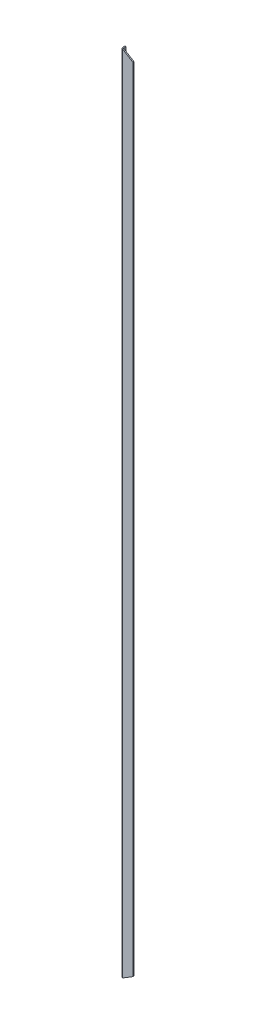
ISO-10303-21;
HEADER;
FILE_DESCRIPTION(('STEP AP214'),'2;1');
FILE_NAME('part.step','',(''),(''),'','','');
FILE_SCHEMA(('AUTOMOTIVE_DESIGN { 1 0 10303 214 1 1 1 1 }'));
ENDSEC;
DATA;
#1=APPLICATION_CONTEXT('core data for automotive mechanical design processes');
#2=APPLICATION_PROTOCOL_DEFINITION('international standard','automotive_design',2000,#1);
#3=PRODUCT_CONTEXT('',#1,'mechanical');
#4=PRODUCT('Part','Part','',(#3));
#5=PRODUCT_RELATED_PRODUCT_CATEGORY('part','',(#4));
#6=PRODUCT_DEFINITION_FORMATION('','',#4);
#7=PRODUCT_DEFINITION_CONTEXT('part definition',#1,'design');
#8=PRODUCT_DEFINITION('design','',#6,#7);
#9=PRODUCT_DEFINITION_SHAPE('','',#8);
#10=(LENGTH_UNIT() NAMED_UNIT(*) SI_UNIT(.MILLI.,.METRE.));
#11=(NAMED_UNIT(*) PLANE_ANGLE_UNIT() SI_UNIT($,.RADIAN.));
#12=(NAMED_UNIT(*) SI_UNIT($,.STERADIAN.) SOLID_ANGLE_UNIT());
#13=UNCERTAINTY_MEASURE_WITH_UNIT(LENGTH_MEASURE(1.E-05),#10,'distance_accuracy_value','');
#14=(GEOMETRIC_REPRESENTATION_CONTEXT(3) GLOBAL_UNCERTAINTY_ASSIGNED_CONTEXT((#13)) GLOBAL_UNIT_ASSIGNED_CONTEXT((#10,
#11,#12)) REPRESENTATION_CONTEXT('',''));
#15=CARTESIAN_POINT('',(0.,0.,0.));
#16=DIRECTION('',(0.,0.,1.));
#17=DIRECTION('',(1.,0.,0.));
#18=AXIS2_PLACEMENT_3D('',#15,#16,#17);
#19=CARTESIAN_POINT('',(3791.85552570873,-1200.,859.999999999999));
#20=DIRECTION('',(0.,0.,-1.));
#21=DIRECTION('',(0.,-1.,0.));
#22=AXIS2_PLACEMENT_3D('',#19,#20,#21);
#23=PLANE('',#22);
#24=DIRECTION('',(0.,1.,0.));
#25=VECTOR('',#24,1.);
#26=CARTESIAN_POINT('',(-373.333333333333,-155.,859.999999999999));
#27=LINE('',#26,#25);
#28=CARTESIAN_POINT('',(-373.333333333333,-1196.29289321881,860.));
#29=VERTEX_POINT('',#28);
#30=CARTESIAN_POINT('',(-373.333333333333,886.292893218813,860.));
#31=VERTEX_POINT('',#30);
#32=EDGE_CURVE('E134',#29,#31,#27,.T.);
#33=ORIENTED_EDGE('',*,*,#32,.T.);
#34=DIRECTION('',(-1.,0.,0.));
#35=VECTOR('',#34,1.);
#36=CARTESIAN_POINT('',(3791.85552570873,886.292893218813,860.));
#37=LINE('',#36,#35);
#38=CARTESIAN_POINT('',(-370.333333333333,886.292893218813,860.));
#39=VERTEX_POINT('',#38);
#40=EDGE_CURVE('E148',#39,#31,#37,.T.);
#41=ORIENTED_EDGE('',*,*,#40,.F.);
#42=DIRECTION('',(0.,1.,0.));
#43=VECTOR('',#42,1.);
#44=CARTESIAN_POINT('',(-370.333333333333,-1200.,859.999999999999));
#45=LINE('',#44,#43);
#46=CARTESIAN_POINT('',(-370.333333333333,-1196.29289321881,860.));
#47=VERTEX_POINT('',#46);
#48=EDGE_CURVE('E69',#39,#47,#45,.F.);
#49=ORIENTED_EDGE('',*,*,#48,.T.);
#50=DIRECTION('',(-1.,0.,0.));
#51=VECTOR('',#50,1.);
#52=CARTESIAN_POINT('',(3791.85552570873,-1196.29289321881,860.));
#53=LINE('',#52,#51);
#54=EDGE_CURVE('E138',#47,#29,#53,.T.);
#55=ORIENTED_EDGE('',*,*,#54,.T.);
#56=EDGE_LOOP('',(#33,#41,#49,#55));
#57=FACE_BOUND('',#56,.T.);
#58=ADVANCED_FACE('F48',(#57),#23,.T.);
#59=CARTESIAN_POINT('',(3791.85552570873,-1196.29289321881,866.999999999999));
#60=DIRECTION('',(0.,-1.,0.));
#61=DIRECTION('',(1.,0.,0.));
#62=AXIS2_PLACEMENT_3D('',#59,#60,#61);
#63=PLANE('',#62);
#64=DIRECTION('',(0.,0.,-1.));
#65=VECTOR('',#64,1.);
#66=CARTESIAN_POINT('',(-373.333333333333,-1196.29289321881,866.999999999999));
#67=LINE('',#66,#65);
#68=CARTESIAN_POINT('',(-373.333333333333,-1196.29289321881,866.));
#69=VERTEX_POINT('',#68);
#70=EDGE_CURVE('E127',#69,#29,#67,.T.);
#71=ORIENTED_EDGE('',*,*,#70,.T.);
#72=ORIENTED_EDGE('',*,*,#54,.F.);
#73=DIRECTION('',(0.,0.,-1.));
#74=VECTOR('',#73,1.);
#75=CARTESIAN_POINT('',(-370.333333333333,-1196.29289321881,866.999999999999));
#76=LINE('',#75,#74);
#77=CARTESIAN_POINT('',(-370.333333333333,-1196.29289321881,865.999999999999));
#78=VERTEX_POINT('',#77);
#79=EDGE_CURVE('E137',#47,#78,#76,.F.);
#80=ORIENTED_EDGE('',*,*,#79,.T.);
#81=CARTESIAN_POINT('',(-373.333333333333,-1196.29289321881,866.));
#82=CARTESIAN_POINT('',(-370.333333333333,-1196.29289321881,866.));
#83=B_SPLINE_CURVE_WITH_KNOTS('',1,(#81,#82),.UNSPECIFIED.,.F.,.F.,(2,2),(0.,1.),.UNSPECIFIED.);
#84=EDGE_CURVE('E141',#78,#69,#83,.F.);
#85=ORIENTED_EDGE('',*,*,#84,.T.);
#86=EDGE_LOOP('',(#71,#72,#80,#85));
#87=FACE_BOUND('',#86,.T.);
#88=ADVANCED_FACE('F143',(#87),#63,.T.);
#89=CARTESIAN_POINT('',(-373.333333333333,-155.,866.999999999999));
#90=DIRECTION('',(1.,0.,0.));
#91=DIRECTION('',(0.,0.,-1.));
#92=AXIS2_PLACEMENT_3D('',#89,#90,#91);
#93=PLANE('',#92);
#94=ORIENTED_EDGE('',*,*,#32,.F.);
#95=ORIENTED_EDGE('',*,*,#70,.F.);
#96=DIRECTION('',(0.,1.,0.));
#97=VECTOR('',#96,1.);
#98=CARTESIAN_POINT('',(-373.333333333333,886.292893218813,865.999999999999));
#99=LINE('',#98,#97);
#100=CARTESIAN_POINT('',(-373.333333333333,886.292893218813,866.));
#101=VERTEX_POINT('',#100);
#102=EDGE_CURVE('E132',#101,#69,#99,.F.);
#103=ORIENTED_EDGE('',*,*,#102,.F.);
#104=DIRECTION('',(0.,0.,-1.));
#105=VECTOR('',#104,1.);
#106=CARTESIAN_POINT('',(-373.333333333333,886.292893218813,866.999999999999));
#107=LINE('',#106,#105);
#108=EDGE_CURVE('E176',#31,#101,#107,.F.);
#109=ORIENTED_EDGE('',*,*,#108,.F.);
#110=EDGE_LOOP('',(#94,#95,#103,#109));
#111=FACE_BOUND('',#110,.T.);
#112=ADVANCED_FACE('F129',(#111),#93,.F.);
#113=CARTESIAN_POINT('',(3791.85552570873,886.292893218813,866.999999999999));
#114=DIRECTION('',(0.,-1.,0.));
#115=DIRECTION('',(1.,0.,0.));
#116=AXIS2_PLACEMENT_3D('',#113,#114,#115);
#117=PLANE('',#116);
#118=ORIENTED_EDGE('',*,*,#40,.T.);
#119=ORIENTED_EDGE('',*,*,#108,.T.);
#120=CARTESIAN_POINT('',(-370.333333333333,886.292893218811,866.));
#121=CARTESIAN_POINT('',(-373.333333333333,886.292893218811,866.));
#122=B_SPLINE_CURVE_WITH_KNOTS('',1,(#120,#121),.UNSPECIFIED.,.F.,.F.,(2,2),(0.,1.),.UNSPECIFIED.);
#123=CARTESIAN_POINT('',(-370.333333333333,886.292893218813,866.));
#124=VERTEX_POINT('',#123);
#125=EDGE_CURVE('E167',#124,#101,#122,.T.);
#126=ORIENTED_EDGE('',*,*,#125,.F.);
#127=DIRECTION('',(0.,0.,-1.));
#128=VECTOR('',#127,1.);
#129=CARTESIAN_POINT('',(-370.333333333333,886.292893218813,866.999999999999));
#130=LINE('',#129,#128);
#131=EDGE_CURVE('E60',#39,#124,#130,.F.);
#132=ORIENTED_EDGE('',*,*,#131,.F.);
#133=EDGE_LOOP('',(#118,#119,#126,#132));
#134=FACE_BOUND('',#133,.T.);
#135=ADVANCED_FACE('F186',(#134),#117,.F.);
#136=CARTESIAN_POINT('',(-370.333333333333,-155.,866.999999999999));
#137=DIRECTION('',(1.,0.,0.));
#138=DIRECTION('',(0.,0.,-1.));
#139=AXIS2_PLACEMENT_3D('',#136,#137,#138);
#140=PLANE('',#139);
#141=ORIENTED_EDGE('',*,*,#131,.T.);
#142=DIRECTION('',(0.,1.,0.));
#143=VECTOR('',#142,1.);
#144=CARTESIAN_POINT('',(-370.333333333333,886.292893218813,865.999999999999));
#145=LINE('',#144,#143);
#146=EDGE_CURVE('E13',#124,#78,#145,.F.);
#147=ORIENTED_EDGE('',*,*,#146,.T.);
#148=ORIENTED_EDGE('',*,*,#79,.F.);
#149=ORIENTED_EDGE('',*,*,#48,.F.);
#150=EDGE_LOOP('',(#141,#147,#148,#149));
#151=FACE_BOUND('',#150,.T.);
#152=ADVANCED_FACE('F50',(#151),#140,.T.);
#153=CARTESIAN_POINT('',(-343.333333333333,-1180.,-3294.32467514242));
#154=DIRECTION('',(-1.,0.,0.));
#155=DIRECTION('',(0.,0.,1.));
#156=AXIS2_PLACEMENT_3D('',#153,#154,#155);
#157=PLANE('',#156);
#158=DIRECTION('',(0.,1.,0.));
#159=VECTOR('',#158,1.);
#160=CARTESIAN_POINT('',(-343.333333333333,-155.,869.999999999999));
#161=LINE('',#160,#159);
#162=CARTESIAN_POINT('',(-343.333333333333,-1180.,869.999999999999));
#163=VERTEX_POINT('',#162);
#164=CARTESIAN_POINT('',(-343.333333333333,870.,869.999999999999));
#165=VERTEX_POINT('',#164);
#166=EDGE_CURVE('E94',#163,#165,#161,.T.);
#167=ORIENTED_EDGE('',*,*,#166,.F.);
#168=DIRECTION('',(0.,0.,1.));
#169=VECTOR('',#168,1.);
#170=CARTESIAN_POINT('',(-343.333333333333,-1180.,-3294.32467514242));
#171=LINE('',#170,#169);
#172=CARTESIAN_POINT('',(-343.333333333333,-1180.,867.));
#173=VERTEX_POINT('',#172);
#174=EDGE_CURVE('E170',#173,#163,#171,.T.);
#175=ORIENTED_EDGE('',*,*,#174,.F.);
#176=DIRECTION('',(0.,1.,0.));
#177=VECTOR('',#176,1.);
#178=CARTESIAN_POINT('',(-343.333333333333,-1180.,867.));
#179=LINE('',#178,#177);
#180=CARTESIAN_POINT('',(-343.333333333333,870.,867.));
#181=VERTEX_POINT('',#180);
#182=EDGE_CURVE('E242',#181,#173,#179,.F.);
#183=ORIENTED_EDGE('',*,*,#182,.F.);
#184=DIRECTION('',(0.,0.,1.));
#185=VECTOR('',#184,1.);
#186=CARTESIAN_POINT('',(-343.333333333333,870.,-3294.32467514242));
#187=LINE('',#186,#185);
#188=EDGE_CURVE('E265',#181,#165,#187,.T.);
#189=ORIENTED_EDGE('',*,*,#188,.T.);
#190=EDGE_LOOP('',(#167,#175,#183,#189));
#191=FACE_BOUND('',#190,.T.);
#192=ADVANCED_FACE('F202',(#191),#157,.F.);
#193=CARTESIAN_POINT('',(363.205786838341,-745.20669527897,-3294.32467514242));
#194=DIRECTION('',(-0.524097425664335,0.851658316704544,0.));
#195=DIRECTION('',(-0.851658316704544,-0.524097425664335,0.));
#196=AXIS2_PLACEMENT_3D('',#193,#194,#195);
#197=PLANE('',#196);
#198=DIRECTION('',(-0.851658316704544,-0.524097425664335,0.));
#199=VECTOR('',#198,1.);
#200=CARTESIAN_POINT('',(363.205786838341,-745.20669527897,869.999999999999));
#201=LINE('',#200,#199);
#202=CARTESIAN_POINT('',(-369.333333333333,-1196.,869.999999999999));
#203=VERTEX_POINT('',#202);
#204=EDGE_CURVE('E101',#163,#203,#201,.T.);
#205=ORIENTED_EDGE('',*,*,#204,.T.);
#206=CARTESIAN_POINT('',(-369.333333333333,-1196.,867.));
#207=CARTESIAN_POINT('',(-369.333333333333,-1196.,869.999999999999));
#208=B_SPLINE_CURVE_WITH_KNOTS('',1,(#206,#207),.UNSPECIFIED.,.F.,.F.,(2,2),(0.,1.),.UNSPECIFIED.);
#209=CARTESIAN_POINT('',(-369.333333333333,-1196.,867.));
#210=VERTEX_POINT('',#209);
#211=EDGE_CURVE('E155',#210,#203,#208,.T.);
#212=ORIENTED_EDGE('',*,*,#211,.F.);
#213=DIRECTION('',(-0.851658316704544,-0.524097425664335,0.));
#214=VECTOR('',#213,1.);
#215=CARTESIAN_POINT('',(363.205786838341,-745.20669527897,867.));
#216=LINE('',#215,#214);
#217=EDGE_CURVE('E269',#173,#210,#216,.T.);
#218=ORIENTED_EDGE('',*,*,#217,.F.);
#219=ORIENTED_EDGE('',*,*,#174,.T.);
#220=EDGE_LOOP('',(#205,#212,#218,#219));
#221=FACE_BOUND('',#220,.T.);
#222=ADVANCED_FACE('F205',(#221),#197,.F.);
#223=CARTESIAN_POINT('',(363.205786838342,435.206695278963,-3294.32467514242));
#224=DIRECTION('',(-0.52409742566434,-0.851658316704541,0.));
#225=DIRECTION('',(0.851658316704541,-0.52409742566434,0.));
#226=AXIS2_PLACEMENT_3D('',#223,#224,#225);
#227=PLANE('',#226);
#228=DIRECTION('',(0.851658316704541,-0.52409742566434,0.));
#229=VECTOR('',#228,1.);
#230=CARTESIAN_POINT('',(363.205786838342,435.206695278963,869.999999999999));
#231=LINE('',#230,#229);
#232=CARTESIAN_POINT('',(-369.333333333333,886.,870.));
#233=VERTEX_POINT('',#232);
#234=EDGE_CURVE('E243',#233,#165,#231,.T.);
#235=ORIENTED_EDGE('',*,*,#234,.T.);
#236=ORIENTED_EDGE('',*,*,#188,.F.);
#237=DIRECTION('',(0.851658316704541,-0.52409742566434,0.));
#238=VECTOR('',#237,1.);
#239=CARTESIAN_POINT('',(363.205786838342,435.206695278963,867.));
#240=LINE('',#239,#238);
#241=CARTESIAN_POINT('',(-369.333333333333,886.,866.999999999999));
#242=VERTEX_POINT('',#241);
#243=EDGE_CURVE('E263',#242,#181,#240,.T.);
#244=ORIENTED_EDGE('',*,*,#243,.F.);
#245=CARTESIAN_POINT('',(-369.333333333333,885.999999999998,869.999999999999));
#246=CARTESIAN_POINT('',(-369.333333333333,885.999999999998,867.));
#247=B_SPLINE_CURVE_WITH_KNOTS('',1,(#245,#246),.UNSPECIFIED.,.F.,.F.,(2,2),(0.,1.),.UNSPECIFIED.);
#248=EDGE_CURVE('E259',#242,#233,#247,.F.);
#249=ORIENTED_EDGE('',*,*,#248,.T.);
#250=EDGE_LOOP('',(#235,#236,#244,#249));
#251=FACE_BOUND('',#250,.T.);
#252=ADVANCED_FACE('F209',(#251),#227,.F.);
#253=CARTESIAN_POINT('',(0.00166666666712167,-155.,867.));
#254=DIRECTION('',(0.,0.,1.));
#255=DIRECTION('',(1.,0.,0.));
#256=AXIS2_PLACEMENT_3D('',#253,#254,#255);
#257=PLANE('',#256);
#258=ORIENTED_EDGE('',*,*,#182,.T.);
#259=ORIENTED_EDGE('',*,*,#217,.T.);
#260=DIRECTION('',(0.,1.,0.));
#261=VECTOR('',#260,1.);
#262=CARTESIAN_POINT('',(-369.333333333333,-155.,867.));
#263=LINE('',#262,#261);
#264=EDGE_CURVE('E266',#242,#210,#263,.F.);
#265=ORIENTED_EDGE('',*,*,#264,.F.);
#266=ORIENTED_EDGE('',*,*,#243,.T.);
#267=EDGE_LOOP('',(#258,#259,#265,#266));
#268=FACE_BOUND('',#267,.T.);
#269=ADVANCED_FACE('F420',(#268),#257,.F.);
#270=CARTESIAN_POINT('',(0.00166666666712167,-155.,869.999999999999));
#271=DIRECTION('',(0.,0.,1.));
#272=DIRECTION('',(1.,0.,0.));
#273=AXIS2_PLACEMENT_3D('',#270,#271,#272);
#274=PLANE('',#273);
#275=ORIENTED_EDGE('',*,*,#204,.F.);
#276=ORIENTED_EDGE('',*,*,#166,.T.);
#277=ORIENTED_EDGE('',*,*,#234,.F.);
#278=DIRECTION('',(0.,1.,0.));
#279=VECTOR('',#278,1.);
#280=CARTESIAN_POINT('',(-369.333333333333,-155.,869.999999999999));
#281=LINE('',#280,#279);
#282=EDGE_CURVE('E240',#233,#203,#281,.F.);
#283=ORIENTED_EDGE('',*,*,#282,.T.);
#284=EDGE_LOOP('',(#275,#276,#277,#283));
#285=FACE_BOUND('',#284,.T.);
#286=ADVANCED_FACE('F415',(#285),#274,.T.);
#287=CARTESIAN_POINT('',(-373.333333333333,-1196.29289321881,866.));
#288=CARTESIAN_POINT('',(-373.333333333333,-1196.26848105947,866.523692974338));
#289=CARTESIAN_POINT('',(-373.229224040006,-1196.24407768235,867.046991537437));
#290=CARTESIAN_POINT('',(-372.82847888675,-1196.19526214588,868.014475921483));
#291=CARTESIAN_POINT('',(-372.532000702925,-1196.17085437764,868.458186879899));
#292=CARTESIAN_POINT('',(-371.791520213232,-1196.12203884117,869.198667369592));
#293=CARTESIAN_POINT('',(-371.347809254816,-1196.09763107294,869.495145553417));
#294=CARTESIAN_POINT('',(-370.38032487077,-1196.04881553647,869.895890706673));
#295=CARTESIAN_POINT('',(-369.857026307671,-1196.02441215935,869.999999999999));
#296=CARTESIAN_POINT('',(-369.333333333333,-1196.,869.999999999999));
#297=CARTESIAN_POINT('',(-370.333333333333,-1196.29289321881,866.));
#298=CARTESIAN_POINT('',(-370.333333333333,-1196.26848119779,866.130922501774));
#299=CARTESIAN_POINT('',(-370.307306010001,-1196.24407768235,866.261747884359));
#300=CARTESIAN_POINT('',(-370.207119721687,-1196.19526214588,866.503618980371));
#301=CARTESIAN_POINT('',(-370.133000175731,-1196.17085437764,866.614546719975));
#302=CARTESIAN_POINT('',(-369.947880053308,-1196.12203884117,866.799666842398));
#303=CARTESIAN_POINT('',(-369.836952313704,-1196.09763107294,866.873786388354));
#304=CARTESIAN_POINT('',(-369.595081217692,-1196.04881553647,866.973972676668));
#305=CARTESIAN_POINT('',(-369.464255835108,-1196.02441202103,867.));
#306=CARTESIAN_POINT('',(-369.333333333333,-1196.,867.));
#307=B_SPLINE_SURFACE_WITH_KNOTS('',1,3,((#287,#288,#289,#290,#291,#292,#293,#294,#295,#296),
(#297,#298,#299,#300,#301,#302,#303,#304,#305,#306)),.UNSPECIFIED.,.F.,.F.,.F.,(2,2),(4,2,2,2,
4),(0.,1.),(0.,0.25,0.5,0.75,1.),.UNSPECIFIED.);
#308=CARTESIAN_POINT('',(-370.333333333333,-1196.29289321881,866.));
#309=CARTESIAN_POINT('',(-370.333333333333,-1196.26848119779,866.130922501774));
#310=CARTESIAN_POINT('',(-370.307306010001,-1196.24407768235,866.261747884359));
#311=CARTESIAN_POINT('',(-370.207119721687,-1196.19526214588,866.503618980371));
#312=CARTESIAN_POINT('',(-370.133000175731,-1196.17085437764,866.614546719975));
#313=CARTESIAN_POINT('',(-369.947880053308,-1196.12203884117,866.799666842398));
#314=CARTESIAN_POINT('',(-369.836952313704,-1196.09763107294,866.873786388354));
#315=CARTESIAN_POINT('',(-369.595081217692,-1196.04881553647,866.973972676668));
#316=CARTESIAN_POINT('',(-369.464255835108,-1196.02441202103,867.));
#317=CARTESIAN_POINT('',(-369.333333333333,-1196.,867.));
#318=B_SPLINE_CURVE_WITH_KNOTS('',3,(#308,#309,#310,#311,#312,#313,#314,#315,#316,#317),
.UNSPECIFIED.,.F.,.F.,(4,2,2,2,4),(0.,0.25,0.5,0.75,1.),.UNSPECIFIED.);
#319=EDGE_CURVE('E354',#78,#210,#318,.T.);
#320=CARTESIAN_POINT('',(-369.333333333333,-1196.,869.999999999999));
#321=CARTESIAN_POINT('',(-369.857026307671,-1196.02441215935,869.999999999999));
#322=CARTESIAN_POINT('',(-370.38032487077,-1196.04881553647,869.895890706673));
#323=CARTESIAN_POINT('',(-371.347809254816,-1196.09763107294,869.495145553417));
#324=CARTESIAN_POINT('',(-371.791520213232,-1196.12203884117,869.198667369592));
#325=CARTESIAN_POINT('',(-372.532000702925,-1196.17085437764,868.458186879899));
#326=CARTESIAN_POINT('',(-372.82847888675,-1196.19526214588,868.014475921483));
#327=CARTESIAN_POINT('',(-373.229224040006,-1196.24407768235,867.046991537437));
#328=CARTESIAN_POINT('',(-373.333333333333,-1196.26848105947,866.523692974338));
#329=CARTESIAN_POINT('',(-373.333333333333,-1196.29289321881,866.));
#330=B_SPLINE_CURVE_WITH_KNOTS('',3,(#320,#321,#322,#323,#324,#325,#326,#327,#328,#329),
.UNSPECIFIED.,.F.,.F.,(4,2,2,2,4),(0.,0.25,0.5,0.75,1.),.UNSPECIFIED.);
#331=EDGE_CURVE('E152',#69,#203,#330,.F.);
#332=ORIENTED_EDGE('',*,*,#84,.F.);
#333=ORIENTED_EDGE('',*,*,#319,.T.);
#334=ORIENTED_EDGE('',*,*,#211,.T.);
#335=ORIENTED_EDGE('',*,*,#331,.F.);
#336=EDGE_LOOP('',(#332,#333,#334,#335));
#337=FACE_BOUND('',#336,.T.);
#338=ADVANCED_FACE('F154',(#337),#307,.T.);
#339=CARTESIAN_POINT('',(-369.333333333333,885.999999999998,869.999999999999));
#340=CARTESIAN_POINT('',(-369.857026307672,886.024412159345,869.999999999999));
#341=CARTESIAN_POINT('',(-370.38032487077,886.048815536467,869.895890706673));
#342=CARTESIAN_POINT('',(-371.347809254816,886.097631072936,869.495145553417));
#343=CARTESIAN_POINT('',(-371.791520213232,886.12203884117,869.198667369592));
#344=CARTESIAN_POINT('',(-372.532000702925,886.170854377639,868.458186879899));
#345=CARTESIAN_POINT('',(-372.82847888675,886.195262145874,868.014475921483));
#346=CARTESIAN_POINT('',(-373.229224040006,886.244077682343,867.046991537437));
#347=CARTESIAN_POINT('',(-373.333333333333,886.268481059465,866.523692974338));
#348=CARTESIAN_POINT('',(-373.333333333333,886.292893218811,866.));
#349=CARTESIAN_POINT('',(-369.333333333333,885.999999999998,867.));
#350=CARTESIAN_POINT('',(-369.464255835108,886.024412021026,867.));
#351=CARTESIAN_POINT('',(-369.595081217692,886.048815536467,866.973972676668));
#352=CARTESIAN_POINT('',(-369.836952313704,886.097631072936,866.873786388354));
#353=CARTESIAN_POINT('',(-369.947880053308,886.12203884117,866.799666842398));
#354=CARTESIAN_POINT('',(-370.133000175731,886.170854377639,866.614546719975));
#355=CARTESIAN_POINT('',(-370.207119721687,886.195262145874,866.50361898037));
#356=CARTESIAN_POINT('',(-370.307306010001,886.244077682343,866.261747884359));
#357=CARTESIAN_POINT('',(-370.333333333333,886.268481197784,866.130922501776));
#358=CARTESIAN_POINT('',(-370.333333333333,886.292893218811,866.));
#359=B_SPLINE_SURFACE_WITH_KNOTS('',1,3,((#339,#340,#341,#342,#343,#344,#345,#346,#347,#348),
(#349,#350,#351,#352,#353,#354,#355,#356,#357,#358)),.UNSPECIFIED.,.F.,.F.,.F.,(2,2),(4,2,2,2,
4),(0.,1.),(0.,0.25,0.5,0.75,1.),.UNSPECIFIED.);
#360=CARTESIAN_POINT('',(-369.333333333333,885.999999999998,867.));
#361=CARTESIAN_POINT('',(-369.464255835108,886.024412021026,867.));
#362=CARTESIAN_POINT('',(-369.595081217692,886.048815536467,866.973972676668));
#363=CARTESIAN_POINT('',(-369.836952313704,886.097631072936,866.873786388354));
#364=CARTESIAN_POINT('',(-369.947880053308,886.12203884117,866.799666842398));
#365=CARTESIAN_POINT('',(-370.133000175731,886.170854377639,866.614546719975));
#366=CARTESIAN_POINT('',(-370.207119721687,886.195262145874,866.50361898037));
#367=CARTESIAN_POINT('',(-370.307306010001,886.244077682343,866.261747884359));
#368=CARTESIAN_POINT('',(-370.333333333333,886.268481197784,866.130922501776));
#369=CARTESIAN_POINT('',(-370.333333333333,886.292893218811,866.));
#370=B_SPLINE_CURVE_WITH_KNOTS('',3,(#360,#361,#362,#363,#364,#365,#366,#367,#368,#369),
.UNSPECIFIED.,.F.,.F.,(4,2,2,2,4),(0.,0.25,0.5,0.75,1.),.UNSPECIFIED.);
#371=EDGE_CURVE('E364',#242,#124,#370,.T.);
#372=CARTESIAN_POINT('',(-373.333333333333,886.292893218811,866.));
#373=CARTESIAN_POINT('',(-373.333333333333,886.268481059465,866.523692974338));
#374=CARTESIAN_POINT('',(-373.229224040006,886.244077682343,867.046991537437));
#375=CARTESIAN_POINT('',(-372.82847888675,886.195262145874,868.014475921483));
#376=CARTESIAN_POINT('',(-372.532000702925,886.170854377639,868.458186879899));
#377=CARTESIAN_POINT('',(-371.791520213232,886.12203884117,869.198667369592));
#378=CARTESIAN_POINT('',(-371.347809254816,886.097631072936,869.495145553417));
#379=CARTESIAN_POINT('',(-370.38032487077,886.048815536467,869.895890706673));
#380=CARTESIAN_POINT('',(-369.857026307672,886.024412159345,869.999999999999));
#381=CARTESIAN_POINT('',(-369.333333333333,885.999999999998,869.999999999999));
#382=B_SPLINE_CURVE_WITH_KNOTS('',3,(#372,#373,#374,#375,#376,#377,#378,#379,#380,#381),
.UNSPECIFIED.,.F.,.F.,(4,2,2,2,4),(0.,0.25,0.5,0.75,1.),.UNSPECIFIED.);
#383=EDGE_CURVE('E160',#233,#101,#382,.F.);
#384=ORIENTED_EDGE('',*,*,#248,.F.);
#385=ORIENTED_EDGE('',*,*,#371,.T.);
#386=ORIENTED_EDGE('',*,*,#125,.T.);
#387=ORIENTED_EDGE('',*,*,#383,.F.);
#388=EDGE_LOOP('',(#384,#385,#386,#387));
#389=FACE_BOUND('',#388,.T.);
#390=ADVANCED_FACE('F283',(#389),#359,.T.);
#391=CARTESIAN_POINT('',(-369.333333333333,-3279.0284782838,866.));
#392=DIRECTION('',(0.,1.,0.));
#393=DIRECTION('',(0.,0.,1.));
#394=AXIS2_PLACEMENT_3D('',#391,#392,#393);
#395=CYLINDRICAL_SURFACE('',#394,3.99999999999988);
#396=ORIENTED_EDGE('',*,*,#383,.T.);
#397=ORIENTED_EDGE('',*,*,#102,.T.);
#398=ORIENTED_EDGE('',*,*,#331,.T.);
#399=ORIENTED_EDGE('',*,*,#282,.F.);
#400=EDGE_LOOP('',(#396,#397,#398,#399));
#401=FACE_BOUND('',#400,.T.);
#402=ADVANCED_FACE('F164',(#401),#395,.T.);
#403=CARTESIAN_POINT('',(-369.333333333333,-3279.0284782838,866.));
#404=DIRECTION('',(0.,1.,0.));
#405=DIRECTION('',(0.,0.,1.));
#406=AXIS2_PLACEMENT_3D('',#403,#404,#405);
#407=CYLINDRICAL_SURFACE('',#406,0.999999999999991);
#408=ORIENTED_EDGE('',*,*,#371,.F.);
#409=ORIENTED_EDGE('',*,*,#264,.T.);
#410=ORIENTED_EDGE('',*,*,#319,.F.);
#411=ORIENTED_EDGE('',*,*,#146,.F.);
#412=EDGE_LOOP('',(#408,#409,#410,#411));
#413=FACE_BOUND('',#412,.T.);
#414=ADVANCED_FACE('F296',(#413),#407,.F.);
#415=CLOSED_SHELL('',(#58,#88,#112,#135,#152,#192,#222,#252,#269,#286,#338,#390,#402,#414));
#416=MANIFOLD_SOLID_BREP('B2',#415);
#417=ADVANCED_BREP_SHAPE_REPRESENTATION('',(#18,#416),#14);
#418=SHAPE_DEFINITION_REPRESENTATION(#9,#417);
ENDSEC;
END-ISO-10303-21;
